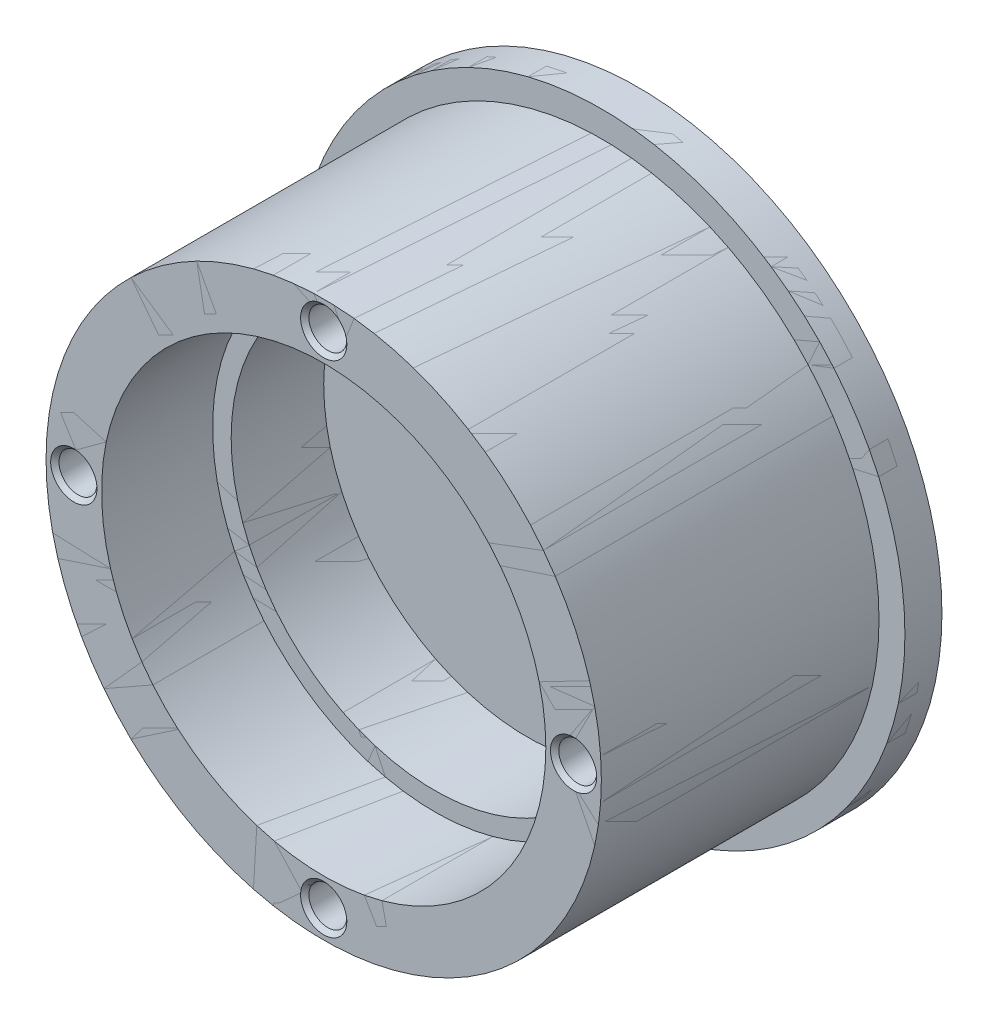
ISO-10303-21;
HEADER;
FILE_DESCRIPTION(('STEP AP214'),'2;1');
FILE_NAME('part.step','',(''),(''),'','','');
FILE_SCHEMA(('AUTOMOTIVE_DESIGN { 1 0 10303 214 1 1 1 1 }'));
ENDSEC;
DATA;
#1=APPLICATION_CONTEXT('core data for automotive mechanical design processes');
#2=APPLICATION_PROTOCOL_DEFINITION('international standard','automotive_design',2000,#1);
#3=PRODUCT_CONTEXT('',#1,'mechanical');
#4=PRODUCT('Part','Part','',(#3));
#5=PRODUCT_RELATED_PRODUCT_CATEGORY('part','',(#4));
#6=PRODUCT_DEFINITION_FORMATION('','',#4);
#7=PRODUCT_DEFINITION_CONTEXT('part definition',#1,'design');
#8=PRODUCT_DEFINITION('design','',#6,#7);
#9=PRODUCT_DEFINITION_SHAPE('','',#8);
#10=(LENGTH_UNIT() NAMED_UNIT(*) SI_UNIT(.MILLI.,.METRE.));
#11=(NAMED_UNIT(*) PLANE_ANGLE_UNIT() SI_UNIT($,.RADIAN.));
#12=(NAMED_UNIT(*) SI_UNIT($,.STERADIAN.) SOLID_ANGLE_UNIT());
#13=UNCERTAINTY_MEASURE_WITH_UNIT(LENGTH_MEASURE(1.E-05),#10,'distance_accuracy_value','');
#14=(GEOMETRIC_REPRESENTATION_CONTEXT(3) GLOBAL_UNCERTAINTY_ASSIGNED_CONTEXT((#13)) GLOBAL_UNIT_ASSIGNED_CONTEXT((#10,
#11,#12)) REPRESENTATION_CONTEXT('',''));
#15=CARTESIAN_POINT('',(0.,0.,0.));
#16=DIRECTION('',(0.,0.,1.));
#17=DIRECTION('',(1.,0.,0.));
#18=AXIS2_PLACEMENT_3D('',#15,#16,#17);
#19=CARTESIAN_POINT('',(0.,0.,-8.5));
#20=DIRECTION('',(0.,0.,1.));
#21=DIRECTION('',(1.,0.,0.));
#22=AXIS2_PLACEMENT_3D('',#19,#20,#21);
#23=CYLINDRICAL_SURFACE('',#22,16.4);
#24=CARTESIAN_POINT('',(0.,0.,-6.5));
#25=DIRECTION('',(0.,0.,-1.));
#26=DIRECTION('',(1.,0.,0.));
#27=AXIS2_PLACEMENT_3D('',#24,#25,#26);
#28=CIRCLE('',#27,16.4);
#29=CARTESIAN_POINT('',(16.4,0.,-6.5));
#30=VERTEX_POINT('',#29);
#31=EDGE_CURVE('P0_E151',#30,#30,#28,.T.);
#32=ORIENTED_EDGE('',*,*,#31,.T.);
#33=EDGE_LOOP('',(#32));
#34=FACE_BOUND('',#33,.T.);
#35=CARTESIAN_POINT('',(0.,0.,-7.5));
#36=DIRECTION('',(0.,0.,-1.));
#37=DIRECTION('',(-1.,0.,0.));
#38=AXIS2_PLACEMENT_3D('',#35,#36,#37);
#39=CIRCLE('',#38,16.4);
#40=CARTESIAN_POINT('',(-16.4,0.,-7.5));
#41=VERTEX_POINT('',#40);
#42=EDGE_CURVE('P0_E181',#41,#41,#39,.T.);
#43=ORIENTED_EDGE('',*,*,#42,.F.);
#44=EDGE_LOOP('',(#43));
#45=FACE_BOUND('',#44,.T.);
#46=ADVANCED_FACE('P0_F47',(#34,#45),#23,.T.);
#47=CARTESIAN_POINT('',(0.,13.5,8.5));
#48=DIRECTION('',(0.,0.,1.));
#49=DIRECTION('',(1.,0.,0.));
#50=AXIS2_PLACEMENT_3D('',#47,#48,#49);
#51=CONICAL_SURFACE('',#50,1.25,0.785398162500002);
#52=CARTESIAN_POINT('',(0.,13.5,8.5));
#53=DIRECTION('',(0.,0.,-1.));
#54=DIRECTION('',(1.,0.,0.));
#55=AXIS2_PLACEMENT_3D('',#52,#53,#54);
#56=CIRCLE('',#55,1.25);
#57=CARTESIAN_POINT('',(1.25000000000005,13.5,8.5));
#58=VERTEX_POINT('',#57);
#59=EDGE_CURVE('P0_E51',#58,#58,#56,.T.);
#60=ORIENTED_EDGE('',*,*,#59,.F.);
#61=EDGE_LOOP('',(#60));
#62=FACE_BOUND('',#61,.T.);
#63=CARTESIAN_POINT('',(0.,13.5,8.275));
#64=DIRECTION('',(0.,0.,1.));
#65=DIRECTION('',(1.,0.,0.));
#66=AXIS2_PLACEMENT_3D('',#63,#64,#65);
#67=CIRCLE('',#66,1.025);
#68=CARTESIAN_POINT('',(1.02500000000005,13.5,8.275));
#69=VERTEX_POINT('',#68);
#70=EDGE_CURVE('P0_E58',#69,#69,#67,.T.);
#71=ORIENTED_EDGE('',*,*,#70,.F.);
#72=EDGE_LOOP('',(#71));
#73=FACE_BOUND('',#72,.T.);
#74=ADVANCED_FACE('P0_F222',(#62,#73),#51,.F.);
#75=CARTESIAN_POINT('',(0.,13.5,8.5));
#76=DIRECTION('',(0.,0.,-1.));
#77=DIRECTION('',(-1.,0.,0.));
#78=AXIS2_PLACEMENT_3D('',#75,#76,#77);
#79=CYLINDRICAL_SURFACE('',#78,1.025);
#80=CARTESIAN_POINT('',(0.,13.5,3.5));
#81=DIRECTION('',(0.,0.,1.));
#82=DIRECTION('',(-1.,0.,0.));
#83=AXIS2_PLACEMENT_3D('',#80,#81,#82);
#84=CIRCLE('',#83,1.025);
#85=CARTESIAN_POINT('',(-1.02499999999995,13.5,3.5));
#86=VERTEX_POINT('',#85);
#87=EDGE_CURVE('P0_E140',#86,#86,#84,.T.);
#88=ORIENTED_EDGE('',*,*,#87,.F.);
#89=EDGE_LOOP('',(#88));
#90=FACE_BOUND('',#89,.T.);
#91=ORIENTED_EDGE('',*,*,#70,.T.);
#92=EDGE_LOOP('',(#91));
#93=FACE_BOUND('',#92,.T.);
#94=ADVANCED_FACE('P0_F227',(#90,#93),#79,.F.);
#95=CARTESIAN_POINT('',(0.,13.5,3.5));
#96=DIRECTION('',(0.,0.,1.));
#97=DIRECTION('',(1.,0.,0.));
#98=AXIS2_PLACEMENT_3D('',#95,#96,#97);
#99=CONICAL_SURFACE('',#98,1.025,1.0297442575);
#100=CARTESIAN_POINT('',(0.,13.5,2.88411786549675));
#101=VERTEX_POINT('',#100);
#102=VERTEX_LOOP('',#101);
#103=FACE_BOUND('',#102,.T.);
#104=ORIENTED_EDGE('',*,*,#87,.T.);
#105=EDGE_LOOP('',(#104));
#106=FACE_BOUND('',#105,.T.);
#107=ADVANCED_FACE('P0_F347',(#103,#106),#99,.F.);
#108=CARTESIAN_POINT('',(13.5,0.,8.5));
#109=DIRECTION('',(0.,0.,1.));
#110=DIRECTION('',(1.,0.,0.));
#111=AXIS2_PLACEMENT_3D('',#108,#109,#110);
#112=CONICAL_SURFACE('',#111,1.25,0.7853981625);
#113=CARTESIAN_POINT('',(13.5,0.,8.5));
#114=DIRECTION('',(0.,0.,-1.));
#115=DIRECTION('',(1.,0.,0.));
#116=AXIS2_PLACEMENT_3D('',#113,#114,#115);
#117=CIRCLE('',#116,1.25);
#118=CARTESIAN_POINT('',(14.75,0.,8.5));
#119=VERTEX_POINT('',#118);
#120=EDGE_CURVE('P0_E190',#119,#119,#117,.T.);
#121=ORIENTED_EDGE('',*,*,#120,.F.);
#122=EDGE_LOOP('',(#121));
#123=FACE_BOUND('',#122,.T.);
#124=CARTESIAN_POINT('',(13.5,0.,8.275));
#125=DIRECTION('',(0.,0.,1.));
#126=DIRECTION('',(1.,0.,0.));
#127=AXIS2_PLACEMENT_3D('',#124,#125,#126);
#128=CIRCLE('',#127,1.025);
#129=CARTESIAN_POINT('',(14.525,0.,8.275));
#130=VERTEX_POINT('',#129);
#131=EDGE_CURVE('P0_E136',#130,#130,#128,.T.);
#132=ORIENTED_EDGE('',*,*,#131,.F.);
#133=EDGE_LOOP('',(#132));
#134=FACE_BOUND('',#133,.T.);
#135=ADVANCED_FACE('P0_F343',(#123,#134),#112,.F.);
#136=CARTESIAN_POINT('',(13.5,0.,8.5));
#137=DIRECTION('',(0.,0.,-1.));
#138=DIRECTION('',(-1.,0.,0.));
#139=AXIS2_PLACEMENT_3D('',#136,#137,#138);
#140=CYLINDRICAL_SURFACE('',#139,1.025);
#141=CARTESIAN_POINT('',(13.5,0.,3.5));
#142=DIRECTION('',(0.,0.,1.));
#143=DIRECTION('',(-1.,0.,0.));
#144=AXIS2_PLACEMENT_3D('',#141,#142,#143);
#145=CIRCLE('',#144,1.025);
#146=CARTESIAN_POINT('',(12.475,0.,3.5));
#147=VERTEX_POINT('',#146);
#148=EDGE_CURVE('P0_E141',#147,#147,#145,.T.);
#149=ORIENTED_EDGE('',*,*,#148,.F.);
#150=EDGE_LOOP('',(#149));
#151=FACE_BOUND('',#150,.T.);
#152=ORIENTED_EDGE('',*,*,#131,.T.);
#153=EDGE_LOOP('',(#152));
#154=FACE_BOUND('',#153,.T.);
#155=ADVANCED_FACE('P0_F137',(#151,#154),#140,.F.);
#156=CARTESIAN_POINT('',(13.5,0.,3.5));
#157=DIRECTION('',(0.,0.,1.));
#158=DIRECTION('',(1.,0.,0.));
#159=AXIS2_PLACEMENT_3D('',#156,#157,#158);
#160=CONICAL_SURFACE('',#159,1.025,1.0297442575);
#161=CARTESIAN_POINT('',(13.5,0.,2.88411786549675));
#162=VERTEX_POINT('',#161);
#163=VERTEX_LOOP('',#162);
#164=FACE_BOUND('',#163,.T.);
#165=ORIENTED_EDGE('',*,*,#148,.T.);
#166=EDGE_LOOP('',(#165));
#167=FACE_BOUND('',#166,.T.);
#168=ADVANCED_FACE('P0_F49',(#164,#167),#160,.F.);
#169=CARTESIAN_POINT('',(0.,-13.5,8.5));
#170=DIRECTION('',(0.,0.,1.));
#171=DIRECTION('',(1.,0.,0.));
#172=AXIS2_PLACEMENT_3D('',#169,#170,#171);
#173=CONICAL_SURFACE('',#172,1.25,0.785398162500002);
#174=CARTESIAN_POINT('',(0.,-13.5,8.5));
#175=DIRECTION('',(0.,0.,-1.));
#176=DIRECTION('',(1.,0.,0.));
#177=AXIS2_PLACEMENT_3D('',#174,#175,#176);
#178=CIRCLE('',#177,1.25);
#179=CARTESIAN_POINT('',(1.24999999999998,-13.5,8.5));
#180=VERTEX_POINT('',#179);
#181=EDGE_CURVE('P0_E169',#180,#180,#178,.T.);
#182=ORIENTED_EDGE('',*,*,#181,.F.);
#183=EDGE_LOOP('',(#182));
#184=FACE_BOUND('',#183,.T.);
#185=CARTESIAN_POINT('',(0.,-13.5,8.275));
#186=DIRECTION('',(0.,0.,1.));
#187=DIRECTION('',(1.,0.,0.));
#188=AXIS2_PLACEMENT_3D('',#185,#186,#187);
#189=CIRCLE('',#188,1.025);
#190=CARTESIAN_POINT('',(1.02499999999998,-13.5,8.275));
#191=VERTEX_POINT('',#190);
#192=EDGE_CURVE('P0_E147',#191,#191,#189,.T.);
#193=ORIENTED_EDGE('',*,*,#192,.F.);
#194=EDGE_LOOP('',(#193));
#195=FACE_BOUND('',#194,.T.);
#196=ADVANCED_FACE('P0_F248',(#184,#195),#173,.F.);
#197=CARTESIAN_POINT('',(0.,-13.5,8.5));
#198=DIRECTION('',(0.,0.,-1.));
#199=DIRECTION('',(-1.,0.,0.));
#200=AXIS2_PLACEMENT_3D('',#197,#198,#199);
#201=CYLINDRICAL_SURFACE('',#200,1.025);
#202=CARTESIAN_POINT('',(0.,-13.5,3.5));
#203=DIRECTION('',(0.,0.,1.));
#204=DIRECTION('',(-1.,0.,0.));
#205=AXIS2_PLACEMENT_3D('',#202,#203,#204);
#206=CIRCLE('',#205,1.025);
#207=CARTESIAN_POINT('',(-1.02500000000002,-13.5,3.5));
#208=VERTEX_POINT('',#207);
#209=EDGE_CURVE('P0_E183',#208,#208,#206,.T.);
#210=ORIENTED_EDGE('',*,*,#209,.F.);
#211=EDGE_LOOP('',(#210));
#212=FACE_BOUND('',#211,.T.);
#213=ORIENTED_EDGE('',*,*,#192,.T.);
#214=EDGE_LOOP('',(#213));
#215=FACE_BOUND('',#214,.T.);
#216=ADVANCED_FACE('P0_F250',(#212,#215),#201,.F.);
#217=CARTESIAN_POINT('',(0.,-13.5,3.5));
#218=DIRECTION('',(0.,0.,1.));
#219=DIRECTION('',(1.,0.,0.));
#220=AXIS2_PLACEMENT_3D('',#217,#218,#219);
#221=CONICAL_SURFACE('',#220,1.025,1.0297442575);
#222=CARTESIAN_POINT('',(0.,-13.5,2.88411786549675));
#223=VERTEX_POINT('',#222);
#224=VERTEX_LOOP('',#223);
#225=FACE_BOUND('',#224,.T.);
#226=ORIENTED_EDGE('',*,*,#209,.T.);
#227=EDGE_LOOP('',(#226));
#228=FACE_BOUND('',#227,.T.);
#229=ADVANCED_FACE('P0_F246',(#225,#228),#221,.F.);
#230=CARTESIAN_POINT('',(-13.5,0.,8.5));
#231=DIRECTION('',(0.,0.,1.));
#232=DIRECTION('',(1.,0.,0.));
#233=AXIS2_PLACEMENT_3D('',#230,#231,#232);
#234=CONICAL_SURFACE('',#233,1.25,0.7853981625);
#235=CARTESIAN_POINT('',(-13.5,0.,8.5));
#236=DIRECTION('',(0.,0.,-1.));
#237=DIRECTION('',(1.,0.,0.));
#238=AXIS2_PLACEMENT_3D('',#235,#236,#237);
#239=CIRCLE('',#238,1.25);
#240=CARTESIAN_POINT('',(-12.25,0.,8.5));
#241=VERTEX_POINT('',#240);
#242=EDGE_CURVE('P0_E163',#241,#241,#239,.T.);
#243=ORIENTED_EDGE('',*,*,#242,.F.);
#244=EDGE_LOOP('',(#243));
#245=FACE_BOUND('',#244,.T.);
#246=CARTESIAN_POINT('',(-13.5,0.,8.275));
#247=DIRECTION('',(0.,0.,1.));
#248=DIRECTION('',(1.,0.,0.));
#249=AXIS2_PLACEMENT_3D('',#246,#247,#248);
#250=CIRCLE('',#249,1.025);
#251=CARTESIAN_POINT('',(-12.475,0.,8.275));
#252=VERTEX_POINT('',#251);
#253=EDGE_CURVE('P0_E186',#252,#252,#250,.T.);
#254=ORIENTED_EDGE('',*,*,#253,.F.);
#255=EDGE_LOOP('',(#254));
#256=FACE_BOUND('',#255,.T.);
#257=ADVANCED_FACE('P0_F243',(#245,#256),#234,.F.);
#258=CARTESIAN_POINT('',(-13.5,0.,8.5));
#259=DIRECTION('',(0.,0.,-1.));
#260=DIRECTION('',(-1.,0.,0.));
#261=AXIS2_PLACEMENT_3D('',#258,#259,#260);
#262=CYLINDRICAL_SURFACE('',#261,1.025);
#263=CARTESIAN_POINT('',(-13.5,0.,3.5));
#264=DIRECTION('',(0.,0.,1.));
#265=DIRECTION('',(-1.,0.,0.));
#266=AXIS2_PLACEMENT_3D('',#263,#264,#265);
#267=CIRCLE('',#266,1.025);
#268=CARTESIAN_POINT('',(-14.525,0.,3.5));
#269=VERTEX_POINT('',#268);
#270=EDGE_CURVE('P0_E161',#269,#269,#267,.T.);
#271=ORIENTED_EDGE('',*,*,#270,.F.);
#272=EDGE_LOOP('',(#271));
#273=FACE_BOUND('',#272,.T.);
#274=ORIENTED_EDGE('',*,*,#253,.T.);
#275=EDGE_LOOP('',(#274));
#276=FACE_BOUND('',#275,.T.);
#277=ADVANCED_FACE('P0_F240',(#273,#276),#262,.F.);
#278=CARTESIAN_POINT('',(-13.5,0.,3.5));
#279=DIRECTION('',(0.,0.,1.));
#280=DIRECTION('',(1.,0.,0.));
#281=AXIS2_PLACEMENT_3D('',#278,#279,#280);
#282=CONICAL_SURFACE('',#281,1.025,1.0297442575);
#283=CARTESIAN_POINT('',(-13.5,0.,2.88411786549675));
#284=VERTEX_POINT('',#283);
#285=VERTEX_LOOP('',#284);
#286=FACE_BOUND('',#285,.T.);
#287=ORIENTED_EDGE('',*,*,#270,.T.);
#288=EDGE_LOOP('',(#287));
#289=FACE_BOUND('',#288,.T.);
#290=ADVANCED_FACE('P0_F233',(#286,#289),#282,.F.);
#291=CARTESIAN_POINT('',(0.,0.,2.5));
#292=DIRECTION('',(0.,0.,1.));
#293=DIRECTION('',(1.,0.,0.));
#294=AXIS2_PLACEMENT_3D('',#291,#292,#293);
#295=CYLINDRICAL_SURFACE('',#294,12.);
#296=CARTESIAN_POINT('',(0.,0.,8.5));
#297=DIRECTION('',(0.,0.,1.));
#298=DIRECTION('',(1.,0.,0.));
#299=AXIS2_PLACEMENT_3D('',#296,#297,#298);
#300=CIRCLE('',#299,12.);
#301=CARTESIAN_POINT('',(12.,0.,8.5));
#302=VERTEX_POINT('',#301);
#303=EDGE_CURVE('P0_E155',#302,#302,#300,.T.);
#304=ORIENTED_EDGE('',*,*,#303,.T.);
#305=EDGE_LOOP('',(#304));
#306=FACE_BOUND('',#305,.T.);
#307=CARTESIAN_POINT('',(0.,0.,2.5));
#308=DIRECTION('',(0.,0.,-1.));
#309=DIRECTION('',(1.,0.,0.));
#310=AXIS2_PLACEMENT_3D('',#307,#308,#309);
#311=CIRCLE('',#310,12.);
#312=CARTESIAN_POINT('',(12.,0.,2.5));
#313=VERTEX_POINT('',#312);
#314=EDGE_CURVE('P0_E154',#313,#313,#311,.T.);
#315=ORIENTED_EDGE('',*,*,#314,.T.);
#316=EDGE_LOOP('',(#315));
#317=FACE_BOUND('',#316,.T.);
#318=ADVANCED_FACE('P0_F216',(#306,#317),#295,.F.);
#319=CARTESIAN_POINT('',(0.,0.,2.5));
#320=DIRECTION('',(0.,0.,1.));
#321=DIRECTION('',(1.,0.,0.));
#322=AXIS2_PLACEMENT_3D('',#319,#320,#321);
#323=PLANE('',#322);
#324=CARTESIAN_POINT('',(0.,0.,2.5));
#325=DIRECTION('',(0.,0.,-1.));
#326=DIRECTION('',(1.,0.,0.));
#327=AXIS2_PLACEMENT_3D('',#324,#325,#326);
#328=CIRCLE('',#327,11.);
#329=CARTESIAN_POINT('',(11.,0.,2.5));
#330=VERTEX_POINT('',#329);
#331=EDGE_CURVE('P0_E179',#330,#330,#328,.T.);
#332=ORIENTED_EDGE('',*,*,#331,.T.);
#333=EDGE_LOOP('',(#332));
#334=FACE_BOUND('',#333,.T.);
#335=ORIENTED_EDGE('',*,*,#314,.F.);
#336=EDGE_LOOP('',(#335));
#337=FACE_BOUND('',#336,.T.);
#338=ADVANCED_FACE('P0_F208',(#334,#337),#323,.T.);
#339=CARTESIAN_POINT('',(0.,0.,-6.5));
#340=DIRECTION('',(0.,0.,-1.));
#341=DIRECTION('',(0.,-1.,0.));
#342=AXIS2_PLACEMENT_3D('',#339,#340,#341);
#343=PLANE('',#342);
#344=ORIENTED_EDGE('',*,*,#31,.F.);
#345=EDGE_LOOP('',(#344));
#346=FACE_BOUND('',#345,.T.);
#347=CARTESIAN_POINT('',(0.,0.,-6.5));
#348=DIRECTION('',(0.,0.,1.));
#349=DIRECTION('',(1.,0.,0.));
#350=AXIS2_PLACEMENT_3D('',#347,#348,#349);
#351=CIRCLE('',#350,15.);
#352=CARTESIAN_POINT('',(15.,0.,-6.5));
#353=VERTEX_POINT('',#352);
#354=EDGE_CURVE('P0_E172',#353,#353,#351,.T.);
#355=ORIENTED_EDGE('',*,*,#354,.F.);
#356=EDGE_LOOP('',(#355));
#357=FACE_BOUND('',#356,.T.);
#358=ADVANCED_FACE('P0_F205',(#346,#357),#343,.F.);
#359=CARTESIAN_POINT('',(0.,0.,8.5));
#360=DIRECTION('',(0.,0.,1.));
#361=DIRECTION('',(1.,0.,0.));
#362=AXIS2_PLACEMENT_3D('',#359,#360,#361);
#363=PLANE('',#362);
#364=CARTESIAN_POINT('',(0.,0.,8.5));
#365=DIRECTION('',(0.,0.,1.));
#366=DIRECTION('',(1.,0.,0.));
#367=AXIS2_PLACEMENT_3D('',#364,#365,#366);
#368=CIRCLE('',#367,15.);
#369=CARTESIAN_POINT('',(15.,0.,8.5));
#370=VERTEX_POINT('',#369);
#371=EDGE_CURVE('P0_E191',#370,#370,#368,.T.);
#372=ORIENTED_EDGE('',*,*,#371,.T.);
#373=EDGE_LOOP('',(#372));
#374=FACE_BOUND('',#373,.T.);
#375=ORIENTED_EDGE('',*,*,#303,.F.);
#376=EDGE_LOOP('',(#375));
#377=FACE_BOUND('',#376,.T.);
#378=ORIENTED_EDGE('',*,*,#242,.T.);
#379=EDGE_LOOP('',(#378));
#380=FACE_BOUND('',#379,.T.);
#381=ORIENTED_EDGE('',*,*,#181,.T.);
#382=EDGE_LOOP('',(#381));
#383=FACE_BOUND('',#382,.T.);
#384=ORIENTED_EDGE('',*,*,#120,.T.);
#385=EDGE_LOOP('',(#384));
#386=FACE_BOUND('',#385,.T.);
#387=ORIENTED_EDGE('',*,*,#59,.T.);
#388=EDGE_LOOP('',(#387));
#389=FACE_BOUND('',#388,.T.);
#390=ADVANCED_FACE('P0_F207',(#374,#377,#380,#383,#386,#389),#363,.T.);
#391=CARTESIAN_POINT('',(0.,0.,-6.5));
#392=DIRECTION('',(0.,0.,1.));
#393=DIRECTION('',(1.,0.,0.));
#394=AXIS2_PLACEMENT_3D('',#391,#392,#393);
#395=CYLINDRICAL_SURFACE('',#394,15.);
#396=ORIENTED_EDGE('',*,*,#371,.F.);
#397=EDGE_LOOP('',(#396));
#398=FACE_BOUND('',#397,.T.);
#399=ORIENTED_EDGE('',*,*,#354,.T.);
#400=EDGE_LOOP('',(#399));
#401=FACE_BOUND('',#400,.T.);
#402=ADVANCED_FACE('P0_F203',(#398,#401),#395,.T.);
#403=CARTESIAN_POINT('',(0.,0.,-6.5));
#404=DIRECTION('',(0.,0.,1.));
#405=DIRECTION('',(1.,0.,0.));
#406=AXIS2_PLACEMENT_3D('',#403,#404,#405);
#407=CYLINDRICAL_SURFACE('',#406,11.);
#408=CARTESIAN_POINT('',(0.,0.,-2.5));
#409=DIRECTION('',(0.,0.,1.));
#410=DIRECTION('',(-1.,0.,0.));
#411=AXIS2_PLACEMENT_3D('',#408,#409,#410);
#412=CIRCLE('',#411,11.);
#413=CARTESIAN_POINT('',(-11.,0.,-2.5));
#414=VERTEX_POINT('',#413);
#415=EDGE_CURVE('P0_E175',#414,#414,#412,.T.);
#416=ORIENTED_EDGE('',*,*,#415,.F.);
#417=EDGE_LOOP('',(#416));
#418=FACE_BOUND('',#417,.T.);
#419=ORIENTED_EDGE('',*,*,#331,.F.);
#420=EDGE_LOOP('',(#419));
#421=FACE_BOUND('',#420,.T.);
#422=ADVANCED_FACE('P0_F235',(#418,#421),#407,.F.);
#423=CARTESIAN_POINT('',(0.,0.,-7.5));
#424=DIRECTION('',(0.,0.,-1.));
#425=DIRECTION('',(-1.,0.,0.));
#426=AXIS2_PLACEMENT_3D('',#423,#424,#425);
#427=PLANE('',#426);
#428=CARTESIAN_POINT('',(0.,0.,-7.5));
#429=DIRECTION('',(0.,0.,-1.));
#430=DIRECTION('',(-1.,0.,0.));
#431=AXIS2_PLACEMENT_3D('',#428,#429,#430);
#432=CIRCLE('',#431,6.);
#433=CARTESIAN_POINT('',(-6.,0.,-7.5));
#434=VERTEX_POINT('',#433);
#435=EDGE_CURVE('P0_E11',#434,#434,#432,.T.);
#436=ORIENTED_EDGE('',*,*,#435,.F.);
#437=EDGE_LOOP('',(#436));
#438=FACE_BOUND('',#437,.T.);
#439=ORIENTED_EDGE('',*,*,#42,.T.);
#440=EDGE_LOOP('',(#439));
#441=FACE_BOUND('',#440,.T.);
#442=ADVANCED_FACE('P0_F237',(#438,#441),#427,.T.);
#443=CARTESIAN_POINT('',(0.,0.,-2.5));
#444=DIRECTION('',(0.,0.,-1.));
#445=DIRECTION('',(-1.,0.,0.));
#446=AXIS2_PLACEMENT_3D('',#443,#444,#445);
#447=PLANE('',#446);
#448=ORIENTED_EDGE('',*,*,#415,.T.);
#449=EDGE_LOOP('',(#448));
#450=FACE_BOUND('',#449,.T.);
#451=ADVANCED_FACE('P0_F445',(#450),#447,.F.);
#452=CARTESIAN_POINT('',(0.,0.,-11.5));
#453=DIRECTION('',(0.,0.,1.));
#454=DIRECTION('',(1.,0.,0.));
#455=AXIS2_PLACEMENT_3D('',#452,#453,#454);
#456=CYLINDRICAL_SURFACE('',#455,6.);
#457=CARTESIAN_POINT('',(0.,0.,-11.5));
#458=DIRECTION('',(0.,0.,-1.));
#459=DIRECTION('',(-1.,0.,0.));
#460=AXIS2_PLACEMENT_3D('',#457,#458,#459);
#461=CIRCLE('',#460,6.);
#462=CARTESIAN_POINT('',(-6.,0.,-11.5));
#463=VERTEX_POINT('',#462);
#464=EDGE_CURVE('P0_E483',#463,#463,#461,.T.);
#465=ORIENTED_EDGE('',*,*,#464,.F.);
#466=EDGE_LOOP('',(#465));
#467=FACE_BOUND('',#466,.T.);
#468=ORIENTED_EDGE('',*,*,#435,.T.);
#469=EDGE_LOOP('',(#468));
#470=FACE_BOUND('',#469,.T.);
#471=ADVANCED_FACE('P0_F450',(#467,#470),#456,.T.);
#472=CARTESIAN_POINT('',(0.,0.,-11.5));
#473=DIRECTION('',(0.,0.,-1.));
#474=DIRECTION('',(-1.,0.,0.));
#475=AXIS2_PLACEMENT_3D('',#472,#473,#474);
#476=PLANE('',#475);
#477=ORIENTED_EDGE('',*,*,#464,.T.);
#478=EDGE_LOOP('',(#477));
#479=FACE_BOUND('',#478,.T.);
#480=ADVANCED_FACE('P0_F467',(#479),#476,.T.);
#481=CLOSED_SHELL('',(#46,#74,#94,#107,#135,#155,#168,#196,#216,#229,#257,#277,#290,#318,#338,
#358,#390,#402,#422,#442,#451,#471,#480));
#482=MANIFOLD_SOLID_BREP('P0_B2',#481);
#483=CARTESIAN_POINT('',(0.,13.5,8.5));
#484=DIRECTION('',(0.,0.,1.));
#485=DIRECTION('',(1.,0.,0.));
#486=AXIS2_PLACEMENT_3D('',#483,#484,#485);
#487=CONICAL_SURFACE('',#486,1.25,0.785398162500002);
#488=CARTESIAN_POINT('',(0.,13.5,8.5));
#489=DIRECTION('',(0.,0.,-1.));
#490=DIRECTION('',(1.,0.,0.));
#491=AXIS2_PLACEMENT_3D('',#488,#489,#490);
#492=CIRCLE('',#491,1.25);
#493=CARTESIAN_POINT('',(1.25000000000005,13.5,8.5));
#494=VERTEX_POINT('',#493);
#495=EDGE_CURVE('P1_E21',#494,#494,#492,.T.);
#496=ORIENTED_EDGE('',*,*,#495,.F.);
#497=EDGE_LOOP('',(#496));
#498=FACE_BOUND('',#497,.T.);
#499=CARTESIAN_POINT('',(0.,13.5,8.275));
#500=DIRECTION('',(0.,0.,1.));
#501=DIRECTION('',(1.,0.,0.));
#502=AXIS2_PLACEMENT_3D('',#499,#500,#501);
#503=CIRCLE('',#502,1.025);
#504=CARTESIAN_POINT('',(1.02500000000005,13.5,8.275));
#505=VERTEX_POINT('',#504);
#506=EDGE_CURVE('P1_E11',#505,#505,#503,.T.);
#507=ORIENTED_EDGE('',*,*,#506,.F.);
#508=EDGE_LOOP('',(#507));
#509=FACE_BOUND('',#508,.T.);
#510=ADVANCED_FACE('P1_F17',(#498,#509),#487,.F.);
#511=CARTESIAN_POINT('',(0.,13.5,8.5));
#512=DIRECTION('',(0.,0.,-1.));
#513=DIRECTION('',(-1.,0.,0.));
#514=AXIS2_PLACEMENT_3D('',#511,#512,#513);
#515=CYLINDRICAL_SURFACE('',#514,1.025);
#516=CARTESIAN_POINT('',(0.,13.5,3.5));
#517=DIRECTION('',(0.,0.,1.));
#518=DIRECTION('',(-1.,0.,0.));
#519=AXIS2_PLACEMENT_3D('',#516,#517,#518);
#520=CIRCLE('',#519,1.025);
#521=CARTESIAN_POINT('',(-1.02499999999995,13.5,3.5));
#522=VERTEX_POINT('',#521);
#523=EDGE_CURVE('P1_E28',#522,#522,#520,.T.);
#524=ORIENTED_EDGE('',*,*,#523,.F.);
#525=EDGE_LOOP('',(#524));
#526=FACE_BOUND('',#525,.T.);
#527=ORIENTED_EDGE('',*,*,#506,.T.);
#528=EDGE_LOOP('',(#527));
#529=FACE_BOUND('',#528,.T.);
#530=ADVANCED_FACE('P1_F213',(#526,#529),#515,.F.);
#531=CARTESIAN_POINT('',(0.,13.5,3.5));
#532=DIRECTION('',(0.,0.,1.));
#533=DIRECTION('',(1.,0.,0.));
#534=AXIS2_PLACEMENT_3D('',#531,#532,#533);
#535=CONICAL_SURFACE('',#534,1.025,1.0297442575);
#536=CARTESIAN_POINT('',(0.,13.5,2.88411786549675));
#537=VERTEX_POINT('',#536);
#538=VERTEX_LOOP('',#537);
#539=FACE_BOUND('',#538,.T.);
#540=ORIENTED_EDGE('',*,*,#523,.T.);
#541=EDGE_LOOP('',(#540));
#542=FACE_BOUND('',#541,.T.);
#543=ADVANCED_FACE('P1_F219',(#539,#542),#535,.F.);
#544=CARTESIAN_POINT('',(13.5,0.,8.5));
#545=DIRECTION('',(0.,0.,1.));
#546=DIRECTION('',(1.,0.,0.));
#547=AXIS2_PLACEMENT_3D('',#544,#545,#546);
#548=CONICAL_SURFACE('',#547,1.25,0.7853981625);
#549=CARTESIAN_POINT('',(13.5,0.,8.5));
#550=DIRECTION('',(0.,0.,-1.));
#551=DIRECTION('',(1.,0.,0.));
#552=AXIS2_PLACEMENT_3D('',#549,#550,#551);
#553=CIRCLE('',#552,1.25);
#554=CARTESIAN_POINT('',(14.75,0.,8.5));
#555=VERTEX_POINT('',#554);
#556=EDGE_CURVE('P1_E168',#555,#555,#553,.T.);
#557=ORIENTED_EDGE('',*,*,#556,.F.);
#558=EDGE_LOOP('',(#557));
#559=FACE_BOUND('',#558,.T.);
#560=CARTESIAN_POINT('',(13.5,0.,8.275));
#561=DIRECTION('',(0.,0.,1.));
#562=DIRECTION('',(1.,0.,0.));
#563=AXIS2_PLACEMENT_3D('',#560,#561,#562);
#564=CIRCLE('',#563,1.025);
#565=CARTESIAN_POINT('',(14.525,0.,8.275));
#566=VERTEX_POINT('',#565);
#567=EDGE_CURVE('P1_E122',#566,#566,#564,.T.);
#568=ORIENTED_EDGE('',*,*,#567,.F.);
#569=EDGE_LOOP('',(#568));
#570=FACE_BOUND('',#569,.T.);
#571=ADVANCED_FACE('P1_F224',(#559,#570),#548,.F.);
#572=CARTESIAN_POINT('',(13.5,0.,8.5));
#573=DIRECTION('',(0.,0.,-1.));
#574=DIRECTION('',(-1.,0.,0.));
#575=AXIS2_PLACEMENT_3D('',#572,#573,#574);
#576=CYLINDRICAL_SURFACE('',#575,1.025);
#577=CARTESIAN_POINT('',(13.5,0.,3.5));
#578=DIRECTION('',(0.,0.,1.));
#579=DIRECTION('',(-1.,0.,0.));
#580=AXIS2_PLACEMENT_3D('',#577,#578,#579);
#581=CIRCLE('',#580,1.025);
#582=CARTESIAN_POINT('',(12.475,0.,3.5));
#583=VERTEX_POINT('',#582);
#584=EDGE_CURVE('P1_E126',#583,#583,#581,.T.);
#585=ORIENTED_EDGE('',*,*,#584,.F.);
#586=EDGE_LOOP('',(#585));
#587=FACE_BOUND('',#586,.T.);
#588=ORIENTED_EDGE('',*,*,#567,.T.);
#589=EDGE_LOOP('',(#588));
#590=FACE_BOUND('',#589,.T.);
#591=ADVANCED_FACE('P1_F123',(#587,#590),#576,.F.);
#592=CARTESIAN_POINT('',(13.5,0.,3.5));
#593=DIRECTION('',(0.,0.,1.));
#594=DIRECTION('',(1.,0.,0.));
#595=AXIS2_PLACEMENT_3D('',#592,#593,#594);
#596=CONICAL_SURFACE('',#595,1.025,1.0297442575);
#597=CARTESIAN_POINT('',(13.5,0.,2.88411786549675));
#598=VERTEX_POINT('',#597);
#599=VERTEX_LOOP('',#598);
#600=FACE_BOUND('',#599,.T.);
#601=ORIENTED_EDGE('',*,*,#584,.T.);
#602=EDGE_LOOP('',(#601));
#603=FACE_BOUND('',#602,.T.);
#604=ADVANCED_FACE('P1_F19',(#600,#603),#596,.F.);
#605=CARTESIAN_POINT('',(0.,-13.5,8.5));
#606=DIRECTION('',(0.,0.,1.));
#607=DIRECTION('',(1.,0.,0.));
#608=AXIS2_PLACEMENT_3D('',#605,#606,#607);
#609=CONICAL_SURFACE('',#608,1.25,0.785398162500002);
#610=CARTESIAN_POINT('',(0.,-13.5,8.5));
#611=DIRECTION('',(0.,0.,-1.));
#612=DIRECTION('',(1.,0.,0.));
#613=AXIS2_PLACEMENT_3D('',#610,#611,#612);
#614=CIRCLE('',#613,1.25);
#615=CARTESIAN_POINT('',(1.24999999999998,-13.5,8.5));
#616=VERTEX_POINT('',#615);
#617=EDGE_CURVE('P1_E166',#616,#616,#614,.T.);
#618=ORIENTED_EDGE('',*,*,#617,.F.);
#619=EDGE_LOOP('',(#618));
#620=FACE_BOUND('',#619,.T.);
#621=CARTESIAN_POINT('',(0.,-13.5,8.275));
#622=DIRECTION('',(0.,0.,1.));
#623=DIRECTION('',(1.,0.,0.));
#624=AXIS2_PLACEMENT_3D('',#621,#622,#623);
#625=CIRCLE('',#624,1.025);
#626=CARTESIAN_POINT('',(1.02499999999998,-13.5,8.275));
#627=VERTEX_POINT('',#626);
#628=EDGE_CURVE('P1_E134',#627,#627,#625,.T.);
#629=ORIENTED_EDGE('',*,*,#628,.F.);
#630=EDGE_LOOP('',(#629));
#631=FACE_BOUND('',#630,.T.);
#632=ADVANCED_FACE('P1_F242',(#620,#631),#609,.F.);
#633=CARTESIAN_POINT('',(0.,-13.5,8.5));
#634=DIRECTION('',(0.,0.,-1.));
#635=DIRECTION('',(-1.,0.,0.));
#636=AXIS2_PLACEMENT_3D('',#633,#634,#635);
#637=CYLINDRICAL_SURFACE('',#636,1.025);
#638=CARTESIAN_POINT('',(0.,-13.5,3.5));
#639=DIRECTION('',(0.,0.,1.));
#640=DIRECTION('',(-1.,0.,0.));
#641=AXIS2_PLACEMENT_3D('',#638,#639,#640);
#642=CIRCLE('',#641,1.025);
#643=CARTESIAN_POINT('',(-1.02500000000002,-13.5,3.5));
#644=VERTEX_POINT('',#643);
#645=EDGE_CURVE('P1_E162',#644,#644,#642,.T.);
#646=ORIENTED_EDGE('',*,*,#645,.F.);
#647=EDGE_LOOP('',(#646));
#648=FACE_BOUND('',#647,.T.);
#649=ORIENTED_EDGE('',*,*,#628,.T.);
#650=EDGE_LOOP('',(#649));
#651=FACE_BOUND('',#650,.T.);
#652=ADVANCED_FACE('P1_F238',(#648,#651),#637,.F.);
#653=CARTESIAN_POINT('',(0.,-13.5,3.5));
#654=DIRECTION('',(0.,0.,1.));
#655=DIRECTION('',(1.,0.,0.));
#656=AXIS2_PLACEMENT_3D('',#653,#654,#655);
#657=CONICAL_SURFACE('',#656,1.025,1.0297442575);
#658=CARTESIAN_POINT('',(0.,-13.5,2.88411786549675));
#659=VERTEX_POINT('',#658);
#660=VERTEX_LOOP('',#659);
#661=FACE_BOUND('',#660,.T.);
#662=ORIENTED_EDGE('',*,*,#645,.T.);
#663=EDGE_LOOP('',(#662));
#664=FACE_BOUND('',#663,.T.);
#665=ADVANCED_FACE('P1_F241',(#661,#664),#657,.F.);
#666=CARTESIAN_POINT('',(-13.5,0.,8.5));
#667=DIRECTION('',(0.,0.,1.));
#668=DIRECTION('',(1.,0.,0.));
#669=AXIS2_PLACEMENT_3D('',#666,#667,#668);
#670=CONICAL_SURFACE('',#669,1.25,0.7853981625);
#671=CARTESIAN_POINT('',(-13.5,0.,8.5));
#672=DIRECTION('',(0.,0.,-1.));
#673=DIRECTION('',(1.,0.,0.));
#674=AXIS2_PLACEMENT_3D('',#671,#672,#673);
#675=CIRCLE('',#674,1.25);
#676=CARTESIAN_POINT('',(-12.25,0.,8.5));
#677=VERTEX_POINT('',#676);
#678=EDGE_CURVE('P1_E158',#677,#677,#675,.T.);
#679=ORIENTED_EDGE('',*,*,#678,.F.);
#680=EDGE_LOOP('',(#679));
#681=FACE_BOUND('',#680,.T.);
#682=CARTESIAN_POINT('',(-13.5,0.,8.275));
#683=DIRECTION('',(0.,0.,1.));
#684=DIRECTION('',(1.,0.,0.));
#685=AXIS2_PLACEMENT_3D('',#682,#683,#684);
#686=CIRCLE('',#685,1.025);
#687=CARTESIAN_POINT('',(-12.475,0.,8.275));
#688=VERTEX_POINT('',#687);
#689=EDGE_CURVE('P1_E163',#688,#688,#686,.T.);
#690=ORIENTED_EDGE('',*,*,#689,.F.);
#691=EDGE_LOOP('',(#690));
#692=FACE_BOUND('',#691,.T.);
#693=ADVANCED_FACE('P1_F323',(#681,#692),#670,.F.);
#694=CARTESIAN_POINT('',(-13.5,0.,8.5));
#695=DIRECTION('',(0.,0.,-1.));
#696=DIRECTION('',(-1.,0.,0.));
#697=AXIS2_PLACEMENT_3D('',#694,#695,#696);
#698=CYLINDRICAL_SURFACE('',#697,1.025);
#699=CARTESIAN_POINT('',(-13.5,0.,3.5));
#700=DIRECTION('',(0.,0.,1.));
#701=DIRECTION('',(-1.,0.,0.));
#702=AXIS2_PLACEMENT_3D('',#699,#700,#701);
#703=CIRCLE('',#702,1.025);
#704=CARTESIAN_POINT('',(-14.525,0.,3.5));
#705=VERTEX_POINT('',#704);
#706=EDGE_CURVE('P1_E165',#705,#705,#703,.T.);
#707=ORIENTED_EDGE('',*,*,#706,.F.);
#708=EDGE_LOOP('',(#707));
#709=FACE_BOUND('',#708,.T.);
#710=ORIENTED_EDGE('',*,*,#689,.T.);
#711=EDGE_LOOP('',(#710));
#712=FACE_BOUND('',#711,.T.);
#713=ADVANCED_FACE('P1_F331',(#709,#712),#698,.F.);
#714=CARTESIAN_POINT('',(-13.5,0.,3.5));
#715=DIRECTION('',(0.,0.,1.));
#716=DIRECTION('',(1.,0.,0.));
#717=AXIS2_PLACEMENT_3D('',#714,#715,#716);
#718=CONICAL_SURFACE('',#717,1.025,1.0297442575);
#719=CARTESIAN_POINT('',(-13.5,0.,2.88411786549675));
#720=VERTEX_POINT('',#719);
#721=VERTEX_LOOP('',#720);
#722=FACE_BOUND('',#721,.T.);
#723=ORIENTED_EDGE('',*,*,#706,.T.);
#724=EDGE_LOOP('',(#723));
#725=FACE_BOUND('',#724,.T.);
#726=ADVANCED_FACE('P1_F263',(#722,#725),#718,.F.);
#727=CARTESIAN_POINT('',(0.,0.,-2.5));
#728=DIRECTION('',(0.,0.,-1.));
#729=DIRECTION('',(-1.,0.,0.));
#730=AXIS2_PLACEMENT_3D('',#727,#728,#729);
#731=CYLINDRICAL_SURFACE('',#730,12.);
#732=CARTESIAN_POINT('',(0.,0.,-8.5));
#733=DIRECTION('',(0.,0.,-1.));
#734=DIRECTION('',(1.,0.,0.));
#735=AXIS2_PLACEMENT_3D('',#732,#733,#734);
#736=CIRCLE('',#735,12.);
#737=CARTESIAN_POINT('',(12.,0.,-8.5));
#738=VERTEX_POINT('',#737);
#739=EDGE_CURVE('P1_E140',#738,#738,#736,.T.);
#740=ORIENTED_EDGE('',*,*,#739,.T.);
#741=EDGE_LOOP('',(#740));
#742=FACE_BOUND('',#741,.T.);
#743=CARTESIAN_POINT('',(0.,0.,-2.5));
#744=DIRECTION('',(0.,0.,1.));
#745=DIRECTION('',(1.,0.,0.));
#746=AXIS2_PLACEMENT_3D('',#743,#744,#745);
#747=CIRCLE('',#746,12.);
#748=CARTESIAN_POINT('',(12.,0.,-2.5));
#749=VERTEX_POINT('',#748);
#750=EDGE_CURVE('P1_E266',#749,#749,#747,.T.);
#751=ORIENTED_EDGE('',*,*,#750,.T.);
#752=EDGE_LOOP('',(#751));
#753=FACE_BOUND('',#752,.T.);
#754=ADVANCED_FACE('P1_F260',(#742,#753),#731,.F.);
#755=CARTESIAN_POINT('',(0.,0.,-2.5));
#756=DIRECTION('',(0.,0.,-1.));
#757=DIRECTION('',(0.,-1.,0.));
#758=AXIS2_PLACEMENT_3D('',#755,#756,#757);
#759=PLANE('',#758);
#760=CARTESIAN_POINT('',(0.,0.,-2.5));
#761=DIRECTION('',(0.,0.,1.));
#762=DIRECTION('',(-1.,0.,0.));
#763=AXIS2_PLACEMENT_3D('',#760,#761,#762);
#764=CIRCLE('',#763,11.);
#765=CARTESIAN_POINT('',(-11.,0.,-2.5));
#766=VERTEX_POINT('',#765);
#767=EDGE_CURVE('P1_E178',#766,#766,#764,.T.);
#768=ORIENTED_EDGE('',*,*,#767,.T.);
#769=EDGE_LOOP('',(#768));
#770=FACE_BOUND('',#769,.T.);
#771=ORIENTED_EDGE('',*,*,#750,.F.);
#772=EDGE_LOOP('',(#771));
#773=FACE_BOUND('',#772,.T.);
#774=ADVANCED_FACE('P1_F233',(#770,#773),#759,.T.);
#775=CARTESIAN_POINT('',(0.,0.,2.5));
#776=DIRECTION('',(0.,0.,1.));
#777=DIRECTION('',(1.,0.,0.));
#778=AXIS2_PLACEMENT_3D('',#775,#776,#777);
#779=CYLINDRICAL_SURFACE('',#778,12.);
#780=CARTESIAN_POINT('',(0.,0.,8.5));
#781=DIRECTION('',(0.,0.,1.));
#782=DIRECTION('',(1.,0.,0.));
#783=AXIS2_PLACEMENT_3D('',#780,#781,#782);
#784=CIRCLE('',#783,12.);
#785=CARTESIAN_POINT('',(12.,0.,8.5));
#786=VERTEX_POINT('',#785);
#787=EDGE_CURVE('P1_E150',#786,#786,#784,.T.);
#788=ORIENTED_EDGE('',*,*,#787,.T.);
#789=EDGE_LOOP('',(#788));
#790=FACE_BOUND('',#789,.T.);
#791=CARTESIAN_POINT('',(0.,0.,2.5));
#792=DIRECTION('',(0.,0.,-1.));
#793=DIRECTION('',(1.,0.,0.));
#794=AXIS2_PLACEMENT_3D('',#791,#792,#793);
#795=CIRCLE('',#794,12.);
#796=CARTESIAN_POINT('',(12.,0.,2.5));
#797=VERTEX_POINT('',#796);
#798=EDGE_CURVE('P1_E147',#797,#797,#795,.T.);
#799=ORIENTED_EDGE('',*,*,#798,.T.);
#800=EDGE_LOOP('',(#799));
#801=FACE_BOUND('',#800,.T.);
#802=ADVANCED_FACE('P1_F230',(#790,#801),#779,.F.);
#803=CARTESIAN_POINT('',(0.,0.,2.5));
#804=DIRECTION('',(0.,0.,1.));
#805=DIRECTION('',(1.,0.,0.));
#806=AXIS2_PLACEMENT_3D('',#803,#804,#805);
#807=PLANE('',#806);
#808=CARTESIAN_POINT('',(0.,0.,2.5));
#809=DIRECTION('',(0.,0.,-1.));
#810=DIRECTION('',(1.,0.,0.));
#811=AXIS2_PLACEMENT_3D('',#808,#809,#810);
#812=CIRCLE('',#811,11.);
#813=CARTESIAN_POINT('',(11.,0.,2.5));
#814=VERTEX_POINT('',#813);
#815=EDGE_CURVE('P1_E184',#814,#814,#812,.T.);
#816=ORIENTED_EDGE('',*,*,#815,.T.);
#817=EDGE_LOOP('',(#816));
#818=FACE_BOUND('',#817,.T.);
#819=ORIENTED_EDGE('',*,*,#798,.F.);
#820=EDGE_LOOP('',(#819));
#821=FACE_BOUND('',#820,.T.);
#822=ADVANCED_FACE('P1_F194',(#818,#821),#807,.T.);
#823=CARTESIAN_POINT('',(0.,0.,-6.5));
#824=DIRECTION('',(0.,0.,-1.));
#825=DIRECTION('',(0.,-1.,0.));
#826=AXIS2_PLACEMENT_3D('',#823,#824,#825);
#827=PLANE('',#826);
#828=CARTESIAN_POINT('',(0.,0.,-6.5));
#829=DIRECTION('',(0.,0.,-1.));
#830=DIRECTION('',(1.,0.,0.));
#831=AXIS2_PLACEMENT_3D('',#828,#829,#830);
#832=CIRCLE('',#831,16.4);
#833=CARTESIAN_POINT('',(16.4,0.,-6.5));
#834=VERTEX_POINT('',#833);
#835=EDGE_CURVE('P1_E138',#834,#834,#832,.T.);
#836=ORIENTED_EDGE('',*,*,#835,.F.);
#837=EDGE_LOOP('',(#836));
#838=FACE_BOUND('',#837,.T.);
#839=CARTESIAN_POINT('',(0.,0.,-6.5));
#840=DIRECTION('',(0.,0.,1.));
#841=DIRECTION('',(1.,0.,0.));
#842=AXIS2_PLACEMENT_3D('',#839,#840,#841);
#843=CIRCLE('',#842,15.);
#844=CARTESIAN_POINT('',(15.,0.,-6.5));
#845=VERTEX_POINT('',#844);
#846=EDGE_CURVE('P1_E172',#845,#845,#843,.T.);
#847=ORIENTED_EDGE('',*,*,#846,.F.);
#848=EDGE_LOOP('',(#847));
#849=FACE_BOUND('',#848,.T.);
#850=ADVANCED_FACE('P1_F246',(#838,#849),#827,.F.);
#851=CARTESIAN_POINT('',(0.,0.,-8.5));
#852=DIRECTION('',(0.,0.,-1.));
#853=DIRECTION('',(0.,-1.,0.));
#854=AXIS2_PLACEMENT_3D('',#851,#852,#853);
#855=PLANE('',#854);
#856=CARTESIAN_POINT('',(0.,0.,-8.5));
#857=DIRECTION('',(0.,0.,-1.));
#858=DIRECTION('',(1.,0.,0.));
#859=AXIS2_PLACEMENT_3D('',#856,#857,#858);
#860=CIRCLE('',#859,16.4);
#861=CARTESIAN_POINT('',(16.4,0.,-8.5));
#862=VERTEX_POINT('',#861);
#863=EDGE_CURVE('P1_E141',#862,#862,#860,.T.);
#864=ORIENTED_EDGE('',*,*,#863,.T.);
#865=EDGE_LOOP('',(#864));
#866=FACE_BOUND('',#865,.T.);
#867=ORIENTED_EDGE('',*,*,#739,.F.);
#868=EDGE_LOOP('',(#867));
#869=FACE_BOUND('',#868,.T.);
#870=ADVANCED_FACE('P1_F247',(#866,#869),#855,.T.);
#871=CARTESIAN_POINT('',(0.,0.,-8.5));
#872=DIRECTION('',(0.,0.,1.));
#873=DIRECTION('',(1.,0.,0.));
#874=AXIS2_PLACEMENT_3D('',#871,#872,#873);
#875=CYLINDRICAL_SURFACE('',#874,16.4);
#876=ORIENTED_EDGE('',*,*,#835,.T.);
#877=EDGE_LOOP('',(#876));
#878=FACE_BOUND('',#877,.T.);
#879=ORIENTED_EDGE('',*,*,#863,.F.);
#880=EDGE_LOOP('',(#879));
#881=FACE_BOUND('',#880,.T.);
#882=ADVANCED_FACE('P1_F249',(#878,#881),#875,.T.);
#883=CARTESIAN_POINT('',(0.,0.,8.5));
#884=DIRECTION('',(0.,0.,1.));
#885=DIRECTION('',(1.,0.,0.));
#886=AXIS2_PLACEMENT_3D('',#883,#884,#885);
#887=PLANE('',#886);
#888=CARTESIAN_POINT('',(0.,0.,8.5));
#889=DIRECTION('',(0.,0.,1.));
#890=DIRECTION('',(1.,0.,0.));
#891=AXIS2_PLACEMENT_3D('',#888,#889,#890);
#892=CIRCLE('',#891,15.);
#893=CARTESIAN_POINT('',(15.,0.,8.5));
#894=VERTEX_POINT('',#893);
#895=EDGE_CURVE('P1_E169',#894,#894,#892,.T.);
#896=ORIENTED_EDGE('',*,*,#895,.T.);
#897=EDGE_LOOP('',(#896));
#898=FACE_BOUND('',#897,.T.);
#899=ORIENTED_EDGE('',*,*,#787,.F.);
#900=EDGE_LOOP('',(#899));
#901=FACE_BOUND('',#900,.T.);
#902=ORIENTED_EDGE('',*,*,#678,.T.);
#903=EDGE_LOOP('',(#902));
#904=FACE_BOUND('',#903,.T.);
#905=ORIENTED_EDGE('',*,*,#617,.T.);
#906=EDGE_LOOP('',(#905));
#907=FACE_BOUND('',#906,.T.);
#908=ORIENTED_EDGE('',*,*,#556,.T.);
#909=EDGE_LOOP('',(#908));
#910=FACE_BOUND('',#909,.T.);
#911=ORIENTED_EDGE('',*,*,#495,.T.);
#912=EDGE_LOOP('',(#911));
#913=FACE_BOUND('',#912,.T.);
#914=ADVANCED_FACE('P1_F206',(#898,#901,#904,#907,#910,#913),#887,.T.);
#915=CARTESIAN_POINT('',(0.,0.,-6.5));
#916=DIRECTION('',(0.,0.,1.));
#917=DIRECTION('',(1.,0.,0.));
#918=AXIS2_PLACEMENT_3D('',#915,#916,#917);
#919=CYLINDRICAL_SURFACE('',#918,15.);
#920=ORIENTED_EDGE('',*,*,#895,.F.);
#921=EDGE_LOOP('',(#920));
#922=FACE_BOUND('',#921,.T.);
#923=ORIENTED_EDGE('',*,*,#846,.T.);
#924=EDGE_LOOP('',(#923));
#925=FACE_BOUND('',#924,.T.);
#926=ADVANCED_FACE('P1_F199',(#922,#925),#919,.T.);
#927=CARTESIAN_POINT('',(0.,0.,-6.5));
#928=DIRECTION('',(0.,0.,1.));
#929=DIRECTION('',(1.,0.,0.));
#930=AXIS2_PLACEMENT_3D('',#927,#928,#929);
#931=CYLINDRICAL_SURFACE('',#930,11.);
#932=ORIENTED_EDGE('',*,*,#767,.F.);
#933=EDGE_LOOP('',(#932));
#934=FACE_BOUND('',#933,.T.);
#935=ORIENTED_EDGE('',*,*,#815,.F.);
#936=EDGE_LOOP('',(#935));
#937=FACE_BOUND('',#936,.T.);
#938=ADVANCED_FACE('P1_F197',(#934,#937),#931,.F.);
#939=CLOSED_SHELL('',(#510,#530,#543,#571,#591,#604,#632,#652,#665,#693,#713,#726,#754,#774,
#802,#822,#850,#870,#882,#914,#926,#938));
#940=MANIFOLD_SOLID_BREP('P1_B1',#939);
#941=ADVANCED_BREP_SHAPE_REPRESENTATION('',(#18,#482,#940),#14);
#942=SHAPE_DEFINITION_REPRESENTATION(#9,#941);
ENDSEC;
END-ISO-10303-21;
